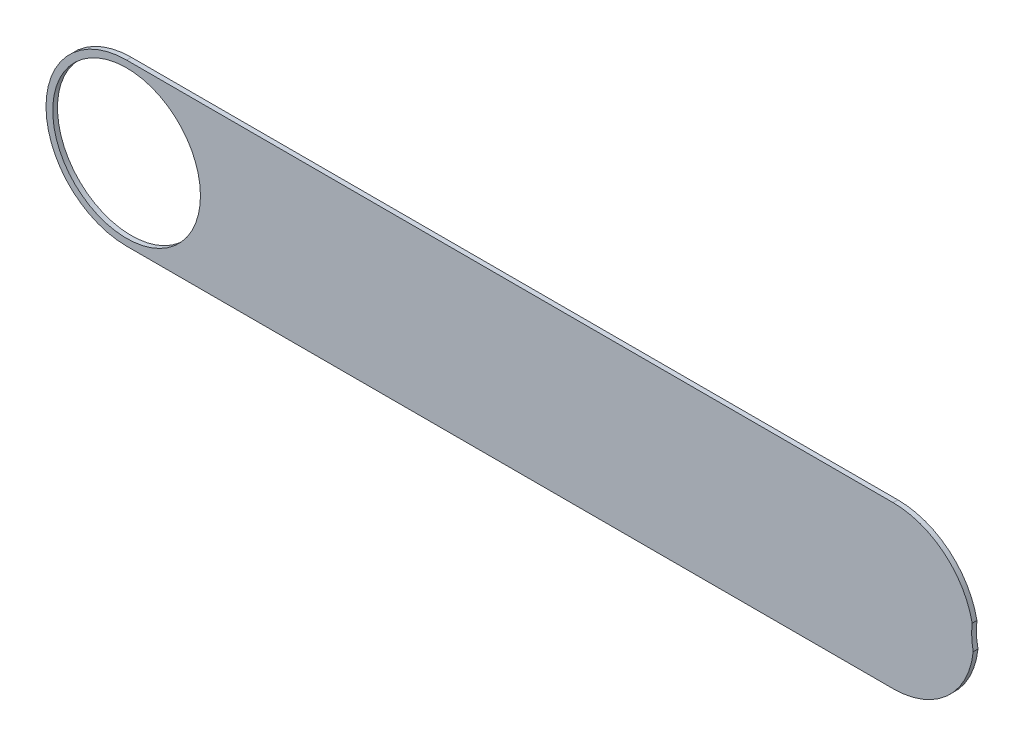
ISO-10303-21;
HEADER;
FILE_DESCRIPTION(('STEP AP214'),'2;1');
FILE_NAME('part.step','',(''),(''),'','','');
FILE_SCHEMA(('AUTOMOTIVE_DESIGN { 1 0 10303 214 1 1 1 1 }'));
ENDSEC;
DATA;
#1=APPLICATION_CONTEXT('core data for automotive mechanical design processes');
#2=APPLICATION_PROTOCOL_DEFINITION('international standard','automotive_design',2000,#1);
#3=PRODUCT_CONTEXT('',#1,'mechanical');
#4=PRODUCT('Part','Part','',(#3));
#5=PRODUCT_RELATED_PRODUCT_CATEGORY('part','',(#4));
#6=PRODUCT_DEFINITION_FORMATION('','',#4);
#7=PRODUCT_DEFINITION_CONTEXT('part definition',#1,'design');
#8=PRODUCT_DEFINITION('design','',#6,#7);
#9=PRODUCT_DEFINITION_SHAPE('','',#8);
#10=(LENGTH_UNIT() NAMED_UNIT(*) SI_UNIT(.MILLI.,.METRE.));
#11=(NAMED_UNIT(*) PLANE_ANGLE_UNIT() SI_UNIT($,.RADIAN.));
#12=(NAMED_UNIT(*) SI_UNIT($,.STERADIAN.) SOLID_ANGLE_UNIT());
#13=UNCERTAINTY_MEASURE_WITH_UNIT(LENGTH_MEASURE(1.E-05),#10,'distance_accuracy_value','');
#14=(GEOMETRIC_REPRESENTATION_CONTEXT(3) GLOBAL_UNCERTAINTY_ASSIGNED_CONTEXT((#13)) GLOBAL_UNIT_ASSIGNED_CONTEXT((#10,
#11,#12)) REPRESENTATION_CONTEXT('',''));
#15=CARTESIAN_POINT('',(0.,0.,0.));
#16=DIRECTION('',(0.,0.,1.));
#17=DIRECTION('',(1.,0.,0.));
#18=AXIS2_PLACEMENT_3D('',#15,#16,#17);
#19=CARTESIAN_POINT('',(78.90002,56.636666,0.));
#20=DIRECTION('',(0.,1.,0.));
#21=DIRECTION('',(1.,0.,0.));
#22=AXIS2_PLACEMENT_3D('',#19,#20,#21);
#23=PLANE('',#22);
#24=DIRECTION('',(1.,0.,0.));
#25=VECTOR('',#24,1.);
#26=CARTESIAN_POINT('',(78.90002,56.636666,0.03556));
#27=LINE('',#26,#25);
#28=CARTESIAN_POINT('',(78.90002,56.636666,0.03556));
#29=VERTEX_POINT('',#28);
#30=CARTESIAN_POINT('',(84.6074,56.636666,0.03556));
#31=VERTEX_POINT('',#30);
#32=EDGE_CURVE('E11',#29,#31,#27,.T.);
#33=ORIENTED_EDGE('',*,*,#32,.F.);
#34=DIRECTION('',(0.,0.,1.));
#35=VECTOR('',#34,1.);
#36=CARTESIAN_POINT('',(78.90002,56.636666,0.));
#37=LINE('',#36,#35);
#38=CARTESIAN_POINT('',(78.90002,56.636666,0.));
#39=VERTEX_POINT('',#38);
#40=EDGE_CURVE('E24',#39,#29,#37,.T.);
#41=ORIENTED_EDGE('',*,*,#40,.F.);
#42=DIRECTION('',(1.,0.,0.));
#43=VECTOR('',#42,1.);
#44=CARTESIAN_POINT('',(78.90002,56.636666,0.));
#45=LINE('',#44,#43);
#46=CARTESIAN_POINT('',(84.6074,56.636666,0.));
#47=VERTEX_POINT('',#46);
#48=EDGE_CURVE('E122',#39,#47,#45,.T.);
#49=ORIENTED_EDGE('',*,*,#48,.T.);
#50=DIRECTION('',(0.,0.,1.));
#51=VECTOR('',#50,1.);
#52=CARTESIAN_POINT('',(84.6074,56.636666,0.));
#53=LINE('',#52,#51);
#54=EDGE_CURVE('E37',#47,#31,#53,.T.);
#55=ORIENTED_EDGE('',*,*,#54,.T.);
#56=EDGE_LOOP('',(#33,#41,#49,#55));
#57=FACE_BOUND('',#56,.T.);
#58=ADVANCED_FACE('F17',(#57),#23,.F.);
#59=CARTESIAN_POINT('',(84.6074,57.2366648,0.));
#60=DIRECTION('',(0.,0.,-1.));
#61=DIRECTION('',(0.,-1.,0.));
#62=AXIS2_PLACEMENT_3D('',#59,#60,#61);
#63=CYLINDRICAL_SURFACE('',#62,0.599998799999995);
#64=CARTESIAN_POINT('',(84.6074,57.2366648,0.03556));
#65=DIRECTION('',(0.,0.,1.));
#66=DIRECTION('',(0.,-1.,0.));
#67=AXIS2_PLACEMENT_3D('',#64,#65,#66);
#68=CIRCLE('',#67,0.599998799999995);
#69=CARTESIAN_POINT('',(85.2040284191817,57.173158190689,0.03556));
#70=VERTEX_POINT('',#69);
#71=EDGE_CURVE('E118',#31,#70,#68,.T.);
#72=ORIENTED_EDGE('',*,*,#71,.F.);
#73=ORIENTED_EDGE('',*,*,#54,.F.);
#74=CARTESIAN_POINT('',(84.6074,57.2366648,0.));
#75=DIRECTION('',(0.,0.,1.));
#76=DIRECTION('',(0.,-1.,0.));
#77=AXIS2_PLACEMENT_3D('',#74,#75,#76);
#78=CIRCLE('',#77,0.599998799999995);
#79=CARTESIAN_POINT('',(85.2040284191817,57.173158190689,0.));
#80=VERTEX_POINT('',#79);
#81=EDGE_CURVE('E115',#47,#80,#78,.T.);
#82=ORIENTED_EDGE('',*,*,#81,.T.);
#83=DIRECTION('',(0.,0.,1.));
#84=VECTOR('',#83,1.);
#85=CARTESIAN_POINT('',(85.2040284191817,57.173158190689,0.));
#86=LINE('',#85,#84);
#87=EDGE_CURVE('E113',#80,#70,#86,.T.);
#88=ORIENTED_EDGE('',*,*,#87,.T.);
#89=EDGE_LOOP('',(#72,#73,#82,#88));
#90=FACE_BOUND('',#89,.T.);
#91=ADVANCED_FACE('F131',(#90),#63,.T.);
#92=CARTESIAN_POINT('',(85.742018,57.2874648,0.));
#93=DIRECTION('',(0.,0.,-1.));
#94=DIRECTION('',(1.,0.,0.));
#95=AXIS2_PLACEMENT_3D('',#92,#93,#94);
#96=CYLINDRICAL_SURFACE('',#95,0.5499989);
#97=DIRECTION('',(0.,0.,1.));
#98=VECTOR('',#97,1.);
#99=CARTESIAN_POINT('',(85.1959658421345,57.3532358490386,0.));
#100=LINE('',#99,#98);
#101=CARTESIAN_POINT('',(85.1959658421345,57.3532358490386,0.));
#102=VERTEX_POINT('',#101);
#103=CARTESIAN_POINT('',(85.1959658421345,57.3532358490386,0.03556));
#104=VERTEX_POINT('',#103);
#105=EDGE_CURVE('E111',#102,#104,#100,.T.);
#106=ORIENTED_EDGE('',*,*,#105,.T.);
#107=CARTESIAN_POINT('',(85.742018,57.2874648,0.03556));
#108=DIRECTION('',(0.,0.,1.));
#109=DIRECTION('',(1.,0.,0.));
#110=AXIS2_PLACEMENT_3D('',#107,#108,#109);
#111=CIRCLE('',#110,0.5499989);
#112=EDGE_CURVE('E108',#104,#70,#111,.T.);
#113=ORIENTED_EDGE('',*,*,#112,.T.);
#114=ORIENTED_EDGE('',*,*,#87,.F.);
#115=CARTESIAN_POINT('',(85.742018,57.2874648,0.));
#116=DIRECTION('',(0.,0.,1.));
#117=DIRECTION('',(1.,0.,0.));
#118=AXIS2_PLACEMENT_3D('',#115,#116,#117);
#119=CIRCLE('',#118,0.5499989);
#120=EDGE_CURVE('E105',#102,#80,#119,.T.);
#121=ORIENTED_EDGE('',*,*,#120,.F.);
#122=EDGE_LOOP('',(#106,#113,#114,#121));
#123=FACE_BOUND('',#122,.T.);
#124=ADVANCED_FACE('F138',(#123),#96,.F.);
#125=CARTESIAN_POINT('',(84.6074,57.2366648,0.));
#126=DIRECTION('',(0.,0.,-1.));
#127=DIRECTION('',(0.,-1.,0.));
#128=AXIS2_PLACEMENT_3D('',#125,#126,#127);
#129=CYLINDRICAL_SURFACE('',#128,0.599998799999995);
#130=CARTESIAN_POINT('',(84.6074,57.2366648,0.03556));
#131=DIRECTION('',(0.,0.,1.));
#132=DIRECTION('',(0.,-1.,0.));
#133=AXIS2_PLACEMENT_3D('',#130,#131,#132);
#134=CIRCLE('',#133,0.599998799999995);
#135=CARTESIAN_POINT('',(84.6074,57.8366636,0.03556));
#136=VERTEX_POINT('',#135);
#137=EDGE_CURVE('E102',#104,#136,#134,.T.);
#138=ORIENTED_EDGE('',*,*,#137,.F.);
#139=ORIENTED_EDGE('',*,*,#105,.F.);
#140=CARTESIAN_POINT('',(84.6074,57.8366636,0.));
#141=VERTEX_POINT('',#140);
#142=EDGE_CURVE('E101',#102,#141,#78,.T.);
#143=ORIENTED_EDGE('',*,*,#142,.T.);
#144=DIRECTION('',(0.,0.,1.));
#145=VECTOR('',#144,1.);
#146=CARTESIAN_POINT('',(84.6074,57.8366636,0.));
#147=LINE('',#146,#145);
#148=EDGE_CURVE('E99',#141,#136,#147,.T.);
#149=ORIENTED_EDGE('',*,*,#148,.T.);
#150=EDGE_LOOP('',(#138,#139,#143,#149));
#151=FACE_BOUND('',#150,.T.);
#152=ADVANCED_FACE('F141',(#151),#129,.T.);
#153=CARTESIAN_POINT('',(84.6074,57.8366636,0.));
#154=DIRECTION('',(0.,-1.,0.));
#155=DIRECTION('',(-1.,0.,0.));
#156=AXIS2_PLACEMENT_3D('',#153,#154,#155);
#157=PLANE('',#156);
#158=DIRECTION('',(-1.,0.,0.));
#159=VECTOR('',#158,1.);
#160=CARTESIAN_POINT('',(84.6074,57.8366636,0.03556));
#161=LINE('',#160,#159);
#162=CARTESIAN_POINT('',(78.90002,57.8366636,0.03556));
#163=VERTEX_POINT('',#162);
#164=EDGE_CURVE('E96',#136,#163,#161,.T.);
#165=ORIENTED_EDGE('',*,*,#164,.F.);
#166=ORIENTED_EDGE('',*,*,#148,.F.);
#167=DIRECTION('',(-1.,0.,0.));
#168=VECTOR('',#167,1.);
#169=CARTESIAN_POINT('',(84.6074,57.8366636,0.));
#170=LINE('',#169,#168);
#171=CARTESIAN_POINT('',(78.90002,57.8366636,0.));
#172=VERTEX_POINT('',#171);
#173=EDGE_CURVE('E93',#141,#172,#170,.T.);
#174=ORIENTED_EDGE('',*,*,#173,.T.);
#175=DIRECTION('',(0.,0.,1.));
#176=VECTOR('',#175,1.);
#177=CARTESIAN_POINT('',(78.90002,57.8366636,0.));
#178=LINE('',#177,#176);
#179=EDGE_CURVE('E91',#172,#163,#178,.T.);
#180=ORIENTED_EDGE('',*,*,#179,.T.);
#181=EDGE_LOOP('',(#165,#166,#174,#180));
#182=FACE_BOUND('',#181,.T.);
#183=ADVANCED_FACE('F145',(#182),#157,.F.);
#184=CARTESIAN_POINT('',(78.90002,57.2366648,0.));
#185=DIRECTION('',(0.,0.,-1.));
#186=DIRECTION('',(0.,1.,0.));
#187=AXIS2_PLACEMENT_3D('',#184,#185,#186);
#188=CYLINDRICAL_SURFACE('',#187,0.599998799999995);
#189=CARTESIAN_POINT('',(78.90002,57.2366648,0.03556));
#190=DIRECTION('',(0.,0.,1.));
#191=DIRECTION('',(0.,1.,0.));
#192=AXIS2_PLACEMENT_3D('',#189,#190,#191);
#193=CIRCLE('',#192,0.599998799999995);
#194=EDGE_CURVE('E88',#163,#29,#193,.T.);
#195=ORIENTED_EDGE('',*,*,#194,.F.);
#196=ORIENTED_EDGE('',*,*,#179,.F.);
#197=CARTESIAN_POINT('',(78.90002,57.2366648,0.));
#198=DIRECTION('',(0.,0.,1.));
#199=DIRECTION('',(0.,1.,0.));
#200=AXIS2_PLACEMENT_3D('',#197,#198,#199);
#201=CIRCLE('',#200,0.599998799999995);
#202=EDGE_CURVE('E80',#172,#39,#201,.T.);
#203=ORIENTED_EDGE('',*,*,#202,.T.);
#204=ORIENTED_EDGE('',*,*,#40,.T.);
#205=EDGE_LOOP('',(#195,#196,#203,#204));
#206=FACE_BOUND('',#205,.T.);
#207=ADVANCED_FACE('F146',(#206),#188,.T.);
#208=CARTESIAN_POINT('',(78.90002,57.2366648,0.));
#209=DIRECTION('',(0.,0.,-1.));
#210=DIRECTION('',(1.,0.,0.));
#211=AXIS2_PLACEMENT_3D('',#208,#209,#210);
#212=CYLINDRICAL_SURFACE('',#211,0.5499989);
#213=DIRECTION('',(0.,0.,1.));
#214=VECTOR('',#213,1.);
#215=CARTESIAN_POINT('',(79.4500189,57.2366648,0.));
#216=LINE('',#215,#214);
#217=CARTESIAN_POINT('',(79.4500189,57.2366648,0.));
#218=VERTEX_POINT('',#217);
#219=CARTESIAN_POINT('',(79.4500189,57.2366648,0.03556));
#220=VERTEX_POINT('',#219);
#221=EDGE_CURVE('E74',#218,#220,#216,.T.);
#222=ORIENTED_EDGE('',*,*,#221,.T.);
#223=CARTESIAN_POINT('',(78.90002,57.2366648,0.03556));
#224=DIRECTION('',(0.,0.,1.));
#225=DIRECTION('',(1.,0.,0.));
#226=AXIS2_PLACEMENT_3D('',#223,#224,#225);
#227=CIRCLE('',#226,0.5499989);
#228=EDGE_CURVE('E79',#220,#220,#227,.T.);
#229=ORIENTED_EDGE('',*,*,#228,.T.);
#230=ORIENTED_EDGE('',*,*,#221,.F.);
#231=CARTESIAN_POINT('',(78.90002,57.2366648,0.));
#232=DIRECTION('',(0.,0.,1.));
#233=DIRECTION('',(1.,0.,0.));
#234=AXIS2_PLACEMENT_3D('',#231,#232,#233);
#235=CIRCLE('',#234,0.5499989);
#236=EDGE_CURVE('E77',#218,#218,#235,.T.);
#237=ORIENTED_EDGE('',*,*,#236,.F.);
#238=EDGE_LOOP('',(#222,#229,#230,#237));
#239=FACE_BOUND('',#238,.T.);
#240=ADVANCED_FACE('F76',(#239),#212,.F.);
#241=CARTESIAN_POINT('',(78.90002,56.636666,0.));
#242=DIRECTION('',(0.,0.,-1.));
#243=DIRECTION('',(-1.,0.,0.));
#244=AXIS2_PLACEMENT_3D('',#241,#242,#243);
#245=PLANE('',#244);
#246=ORIENTED_EDGE('',*,*,#48,.F.);
#247=ORIENTED_EDGE('',*,*,#202,.F.);
#248=ORIENTED_EDGE('',*,*,#173,.F.);
#249=ORIENTED_EDGE('',*,*,#142,.F.);
#250=ORIENTED_EDGE('',*,*,#120,.T.);
#251=ORIENTED_EDGE('',*,*,#81,.F.);
#252=EDGE_LOOP('',(#246,#247,#248,#249,#250,#251));
#253=FACE_BOUND('',#252,.T.);
#254=ORIENTED_EDGE('',*,*,#236,.T.);
#255=EDGE_LOOP('',(#254));
#256=FACE_BOUND('',#255,.T.);
#257=ADVANCED_FACE('F83',(#253,#256),#245,.T.);
#258=CARTESIAN_POINT('',(78.90002,56.636666,0.03556));
#259=DIRECTION('',(0.,0.,-1.));
#260=DIRECTION('',(-1.,0.,0.));
#261=AXIS2_PLACEMENT_3D('',#258,#259,#260);
#262=PLANE('',#261);
#263=ORIENTED_EDGE('',*,*,#194,.T.);
#264=ORIENTED_EDGE('',*,*,#32,.T.);
#265=ORIENTED_EDGE('',*,*,#71,.T.);
#266=ORIENTED_EDGE('',*,*,#112,.F.);
#267=ORIENTED_EDGE('',*,*,#137,.T.);
#268=ORIENTED_EDGE('',*,*,#164,.T.);
#269=EDGE_LOOP('',(#263,#264,#265,#266,#267,#268));
#270=FACE_BOUND('',#269,.T.);
#271=ORIENTED_EDGE('',*,*,#228,.F.);
#272=EDGE_LOOP('',(#271));
#273=FACE_BOUND('',#272,.T.);
#274=ADVANCED_FACE('F134',(#270,#273),#262,.F.);
#275=CLOSED_SHELL('',(#58,#91,#124,#152,#183,#207,#240,#257,#274));
#276=MANIFOLD_SOLID_BREP('B1',#275);
#277=ADVANCED_BREP_SHAPE_REPRESENTATION('',(#18,#276),#14);
#278=SHAPE_DEFINITION_REPRESENTATION(#9,#277);
ENDSEC;
END-ISO-10303-21;
